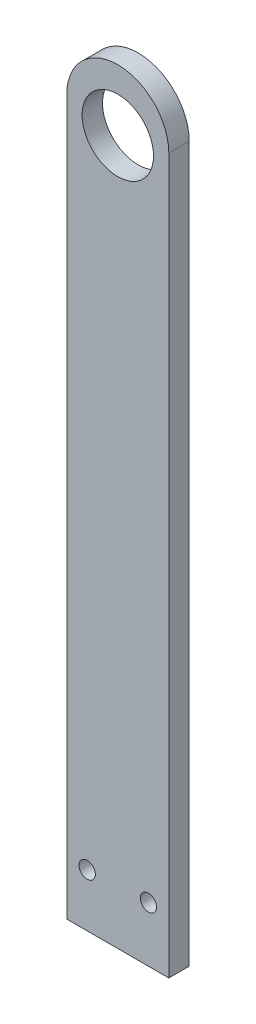
ISO-10303-21;
HEADER;
FILE_DESCRIPTION(('STEP AP214'),'2;1');
FILE_NAME('part.step','',(''),(''),'','','');
FILE_SCHEMA(('AUTOMOTIVE_DESIGN { 1 0 10303 214 1 1 1 1 }'));
ENDSEC;
DATA;
#1=APPLICATION_CONTEXT('core data for automotive mechanical design processes');
#2=APPLICATION_PROTOCOL_DEFINITION('international standard','automotive_design',2000,#1);
#3=PRODUCT_CONTEXT('',#1,'mechanical');
#4=PRODUCT('Part','Part','',(#3));
#5=PRODUCT_RELATED_PRODUCT_CATEGORY('part','',(#4));
#6=PRODUCT_DEFINITION_FORMATION('','',#4);
#7=PRODUCT_DEFINITION_CONTEXT('part definition',#1,'design');
#8=PRODUCT_DEFINITION('design','',#6,#7);
#9=PRODUCT_DEFINITION_SHAPE('','',#8);
#10=(LENGTH_UNIT() NAMED_UNIT(*) SI_UNIT(.MILLI.,.METRE.));
#11=(NAMED_UNIT(*) PLANE_ANGLE_UNIT() SI_UNIT($,.RADIAN.));
#12=(NAMED_UNIT(*) SI_UNIT($,.STERADIAN.) SOLID_ANGLE_UNIT());
#13=UNCERTAINTY_MEASURE_WITH_UNIT(LENGTH_MEASURE(1.E-05),#10,'distance_accuracy_value','');
#14=(GEOMETRIC_REPRESENTATION_CONTEXT(3) GLOBAL_UNCERTAINTY_ASSIGNED_CONTEXT((#13)) GLOBAL_UNIT_ASSIGNED_CONTEXT((#10,
#11,#12)) REPRESENTATION_CONTEXT('',''));
#15=CARTESIAN_POINT('',(0.,0.,0.));
#16=DIRECTION('',(0.,0.,1.));
#17=DIRECTION('',(1.,0.,0.));
#18=AXIS2_PLACEMENT_3D('',#15,#16,#17);
#19=CARTESIAN_POINT('',(0.,0.,4.));
#20=DIRECTION('',(0.,0.,1.));
#21=DIRECTION('',(1.,0.,0.));
#22=AXIS2_PLACEMENT_3D('',#19,#20,#21);
#23=PLANE('',#22);
#24=CARTESIAN_POINT('',(0.,63.,4.));
#25=DIRECTION('',(0.,0.,1.));
#26=DIRECTION('',(1.,0.,0.));
#27=AXIS2_PLACEMENT_3D('',#24,#25,#26);
#28=CIRCLE('',#27,7.);
#29=CARTESIAN_POINT('',(7.,63.,4.));
#30=VERTEX_POINT('',#29);
#31=EDGE_CURVE('E159',#30,#30,#28,.T.);
#32=ORIENTED_EDGE('',*,*,#31,.F.);
#33=EDGE_LOOP('',(#32));
#34=FACE_BOUND('',#33,.T.);
#35=CARTESIAN_POINT('',(-5.99999999999998,-64.6324163857344,4.));
#36=DIRECTION('',(0.,0.,1.));
#37=DIRECTION('',(1.,0.,0.));
#38=AXIS2_PLACEMENT_3D('',#35,#36,#37);
#39=CIRCLE('',#38,1.6);
#40=CARTESIAN_POINT('',(-4.39999999999998,-64.6324163857344,4.));
#41=VERTEX_POINT('',#40);
#42=EDGE_CURVE('E151',#41,#41,#39,.T.);
#43=ORIENTED_EDGE('',*,*,#42,.F.);
#44=EDGE_LOOP('',(#43));
#45=FACE_BOUND('',#44,.T.);
#46=CARTESIAN_POINT('',(6.00000000000002,-64.202233010576,4.));
#47=DIRECTION('',(0.,0.,1.));
#48=DIRECTION('',(1.,0.,0.));
#49=AXIS2_PLACEMENT_3D('',#46,#47,#48);
#50=CIRCLE('',#49,1.6);
#51=CARTESIAN_POINT('',(7.60000000000002,-64.202233010576,4.));
#52=VERTEX_POINT('',#51);
#53=EDGE_CURVE('E143',#52,#52,#50,.T.);
#54=ORIENTED_EDGE('',*,*,#53,.F.);
#55=EDGE_LOOP('',(#54));
#56=FACE_BOUND('',#55,.T.);
#57=DIRECTION('',(0.,1.,0.));
#58=VECTOR('',#57,1.);
#59=CARTESIAN_POINT('',(9.99999999999999,75.,4.));
#60=LINE('',#59,#58);
#61=CARTESIAN_POINT('',(10.,-75.,4.));
#62=VERTEX_POINT('',#61);
#63=CARTESIAN_POINT('',(9.99999999999999,65.,4.));
#64=VERTEX_POINT('',#63);
#65=EDGE_CURVE('E132',#62,#64,#60,.T.);
#66=ORIENTED_EDGE('',*,*,#65,.T.);
#67=CARTESIAN_POINT('',(0.,65.,4.));
#68=DIRECTION('',(0.,0.,1.));
#69=DIRECTION('',(1.,0.,0.));
#70=AXIS2_PLACEMENT_3D('',#67,#68,#69);
#71=CIRCLE('',#70,10.);
#72=CARTESIAN_POINT('',(-10.,65.,4.));
#73=VERTEX_POINT('',#72);
#74=EDGE_CURVE('E109',#64,#73,#71,.T.);
#75=ORIENTED_EDGE('',*,*,#74,.T.);
#76=DIRECTION('',(0.,-1.,0.));
#77=VECTOR('',#76,1.);
#78=CARTESIAN_POINT('',(-10.,75.,4.));
#79=LINE('',#78,#77);
#80=CARTESIAN_POINT('',(-9.99999999999999,-75.,4.));
#81=VERTEX_POINT('',#80);
#82=EDGE_CURVE('E135',#73,#81,#79,.T.);
#83=ORIENTED_EDGE('',*,*,#82,.T.);
#84=DIRECTION('',(1.,0.,0.));
#85=VECTOR('',#84,1.);
#86=CARTESIAN_POINT('',(-9.99999999999999,-75.,4.));
#87=LINE('',#86,#85);
#88=EDGE_CURVE('E75',#81,#62,#87,.T.);
#89=ORIENTED_EDGE('',*,*,#88,.T.);
#90=EDGE_LOOP('',(#66,#75,#83,#89));
#91=FACE_BOUND('',#90,.T.);
#92=ADVANCED_FACE('F57',(#34,#45,#56,#91),#23,.T.);
#93=CARTESIAN_POINT('',(0.,0.,0.));
#94=DIRECTION('',(0.,0.,1.));
#95=DIRECTION('',(1.,0.,0.));
#96=AXIS2_PLACEMENT_3D('',#93,#94,#95);
#97=PLANE('',#96);
#98=CARTESIAN_POINT('',(0.,63.,0.));
#99=DIRECTION('',(0.,0.,1.));
#100=DIRECTION('',(1.,0.,0.));
#101=AXIS2_PLACEMENT_3D('',#98,#99,#100);
#102=CIRCLE('',#101,7.);
#103=CARTESIAN_POINT('',(7.,63.,0.));
#104=VERTEX_POINT('',#103);
#105=EDGE_CURVE('E118',#104,#104,#102,.T.);
#106=ORIENTED_EDGE('',*,*,#105,.T.);
#107=EDGE_LOOP('',(#106));
#108=FACE_BOUND('',#107,.T.);
#109=CARTESIAN_POINT('',(-5.99999999999998,-64.6324163857344,0.));
#110=DIRECTION('',(0.,0.,1.));
#111=DIRECTION('',(1.,0.,0.));
#112=AXIS2_PLACEMENT_3D('',#109,#110,#111);
#113=CIRCLE('',#112,1.6);
#114=CARTESIAN_POINT('',(-4.39999999999998,-64.6324163857344,0.));
#115=VERTEX_POINT('',#114);
#116=EDGE_CURVE('E155',#115,#115,#113,.T.);
#117=ORIENTED_EDGE('',*,*,#116,.T.);
#118=EDGE_LOOP('',(#117));
#119=FACE_BOUND('',#118,.T.);
#120=CARTESIAN_POINT('',(6.00000000000002,-64.202233010576,0.));
#121=DIRECTION('',(0.,0.,1.));
#122=DIRECTION('',(1.,0.,0.));
#123=AXIS2_PLACEMENT_3D('',#120,#121,#122);
#124=CIRCLE('',#123,1.6);
#125=CARTESIAN_POINT('',(7.60000000000002,-64.202233010576,0.));
#126=VERTEX_POINT('',#125);
#127=EDGE_CURVE('E147',#126,#126,#124,.T.);
#128=ORIENTED_EDGE('',*,*,#127,.T.);
#129=EDGE_LOOP('',(#128));
#130=FACE_BOUND('',#129,.T.);
#131=CARTESIAN_POINT('',(0.,65.,0.));
#132=DIRECTION('',(0.,0.,1.));
#133=DIRECTION('',(1.,0.,0.));
#134=AXIS2_PLACEMENT_3D('',#131,#132,#133);
#135=CIRCLE('',#134,10.);
#136=CARTESIAN_POINT('',(9.99999999999999,65.,0.));
#137=VERTEX_POINT('',#136);
#138=CARTESIAN_POINT('',(-10.,65.,0.));
#139=VERTEX_POINT('',#138);
#140=EDGE_CURVE('E95',#137,#139,#135,.T.);
#141=ORIENTED_EDGE('',*,*,#140,.F.);
#142=DIRECTION('',(0.,1.,0.));
#143=VECTOR('',#142,1.);
#144=CARTESIAN_POINT('',(9.99999999999999,75.,0.));
#145=LINE('',#144,#143);
#146=CARTESIAN_POINT('',(10.,-75.,0.));
#147=VERTEX_POINT('',#146);
#148=EDGE_CURVE('E106',#147,#137,#145,.T.);
#149=ORIENTED_EDGE('',*,*,#148,.F.);
#150=DIRECTION('',(1.,0.,0.));
#151=VECTOR('',#150,1.);
#152=CARTESIAN_POINT('',(-9.99999999999999,-75.,0.));
#153=LINE('',#152,#151);
#154=CARTESIAN_POINT('',(-9.99999999999999,-75.,0.));
#155=VERTEX_POINT('',#154);
#156=EDGE_CURVE('E125',#155,#147,#153,.T.);
#157=ORIENTED_EDGE('',*,*,#156,.F.);
#158=DIRECTION('',(0.,-1.,0.));
#159=VECTOR('',#158,1.);
#160=CARTESIAN_POINT('',(-10.,75.,0.));
#161=LINE('',#160,#159);
#162=EDGE_CURVE('E86',#139,#155,#161,.T.);
#163=ORIENTED_EDGE('',*,*,#162,.F.);
#164=EDGE_LOOP('',(#141,#149,#157,#163));
#165=FACE_BOUND('',#164,.T.);
#166=ADVANCED_FACE('F103',(#108,#119,#130,#165),#97,.F.);
#167=CARTESIAN_POINT('',(-10.,75.,4.));
#168=DIRECTION('',(1.,0.,0.));
#169=DIRECTION('',(0.,1.,0.));
#170=AXIS2_PLACEMENT_3D('',#167,#168,#169);
#171=PLANE('',#170);
#172=DIRECTION('',(0.,0.,1.));
#173=VECTOR('',#172,1.);
#174=CARTESIAN_POINT('',(-10.,65.,0.));
#175=LINE('',#174,#173);
#176=EDGE_CURVE('E108',#139,#73,#175,.T.);
#177=ORIENTED_EDGE('',*,*,#176,.F.);
#178=ORIENTED_EDGE('',*,*,#162,.T.);
#179=DIRECTION('',(0.,0.,-1.));
#180=VECTOR('',#179,1.);
#181=CARTESIAN_POINT('',(-9.99999999999999,-75.,4.));
#182=LINE('',#181,#180);
#183=EDGE_CURVE('E12',#81,#155,#182,.T.);
#184=ORIENTED_EDGE('',*,*,#183,.F.);
#185=ORIENTED_EDGE('',*,*,#82,.F.);
#186=EDGE_LOOP('',(#177,#178,#184,#185));
#187=FACE_BOUND('',#186,.T.);
#188=ADVANCED_FACE('F182',(#187),#171,.F.);
#189=CARTESIAN_POINT('',(9.99999999999999,75.,4.));
#190=DIRECTION('',(-1.,0.,0.));
#191=DIRECTION('',(0.,-1.,0.));
#192=AXIS2_PLACEMENT_3D('',#189,#190,#191);
#193=PLANE('',#192);
#194=ORIENTED_EDGE('',*,*,#148,.T.);
#195=DIRECTION('',(0.,0.,1.));
#196=VECTOR('',#195,1.);
#197=CARTESIAN_POINT('',(9.99999999999999,65.,0.));
#198=LINE('',#197,#196);
#199=EDGE_CURVE('E112',#137,#64,#198,.T.);
#200=ORIENTED_EDGE('',*,*,#199,.T.);
#201=ORIENTED_EDGE('',*,*,#65,.F.);
#202=DIRECTION('',(0.,0.,-1.));
#203=VECTOR('',#202,1.);
#204=CARTESIAN_POINT('',(10.,-75.,4.));
#205=LINE('',#204,#203);
#206=EDGE_CURVE('E67',#62,#147,#205,.T.);
#207=ORIENTED_EDGE('',*,*,#206,.T.);
#208=EDGE_LOOP('',(#194,#200,#201,#207));
#209=FACE_BOUND('',#208,.T.);
#210=ADVANCED_FACE('F59',(#209),#193,.F.);
#211=CARTESIAN_POINT('',(-9.99999999999999,-75.,4.));
#212=DIRECTION('',(0.,1.,0.));
#213=DIRECTION('',(0.,0.,1.));
#214=AXIS2_PLACEMENT_3D('',#211,#212,#213);
#215=PLANE('',#214);
#216=ORIENTED_EDGE('',*,*,#156,.T.);
#217=ORIENTED_EDGE('',*,*,#206,.F.);
#218=ORIENTED_EDGE('',*,*,#88,.F.);
#219=ORIENTED_EDGE('',*,*,#183,.T.);
#220=EDGE_LOOP('',(#216,#217,#218,#219));
#221=FACE_BOUND('',#220,.T.);
#222=ADVANCED_FACE('F184',(#221),#215,.F.);
#223=CARTESIAN_POINT('',(0.,65.,0.));
#224=DIRECTION('',(0.,0.,1.));
#225=DIRECTION('',(1.,0.,0.));
#226=AXIS2_PLACEMENT_3D('',#223,#224,#225);
#227=CYLINDRICAL_SURFACE('',#226,10.);
#228=ORIENTED_EDGE('',*,*,#74,.F.);
#229=ORIENTED_EDGE('',*,*,#199,.F.);
#230=ORIENTED_EDGE('',*,*,#140,.T.);
#231=ORIENTED_EDGE('',*,*,#176,.T.);
#232=EDGE_LOOP('',(#228,#229,#230,#231));
#233=FACE_BOUND('',#232,.T.);
#234=ADVANCED_FACE('F113',(#233),#227,.T.);
#235=CARTESIAN_POINT('',(6.00000000000002,-64.202233010576,0.));
#236=DIRECTION('',(0.,0.,1.));
#237=DIRECTION('',(1.,0.,0.));
#238=AXIS2_PLACEMENT_3D('',#235,#236,#237);
#239=CYLINDRICAL_SURFACE('',#238,1.6);
#240=ORIENTED_EDGE('',*,*,#127,.F.);
#241=EDGE_LOOP('',(#240));
#242=FACE_BOUND('',#241,.T.);
#243=ORIENTED_EDGE('',*,*,#53,.T.);
#244=EDGE_LOOP('',(#243));
#245=FACE_BOUND('',#244,.T.);
#246=ADVANCED_FACE('F191',(#242,#245),#239,.F.);
#247=CARTESIAN_POINT('',(-5.99999999999998,-64.6324163857344,0.));
#248=DIRECTION('',(0.,0.,1.));
#249=DIRECTION('',(1.,0.,0.));
#250=AXIS2_PLACEMENT_3D('',#247,#248,#249);
#251=CYLINDRICAL_SURFACE('',#250,1.6);
#252=ORIENTED_EDGE('',*,*,#116,.F.);
#253=EDGE_LOOP('',(#252));
#254=FACE_BOUND('',#253,.T.);
#255=ORIENTED_EDGE('',*,*,#42,.T.);
#256=EDGE_LOOP('',(#255));
#257=FACE_BOUND('',#256,.T.);
#258=ADVANCED_FACE('F172',(#254,#257),#251,.F.);
#259=CARTESIAN_POINT('',(0.,63.,0.));
#260=DIRECTION('',(0.,0.,1.));
#261=DIRECTION('',(1.,0.,0.));
#262=AXIS2_PLACEMENT_3D('',#259,#260,#261);
#263=CYLINDRICAL_SURFACE('',#262,7.);
#264=ORIENTED_EDGE('',*,*,#105,.F.);
#265=EDGE_LOOP('',(#264));
#266=FACE_BOUND('',#265,.T.);
#267=ORIENTED_EDGE('',*,*,#31,.T.);
#268=EDGE_LOOP('',(#267));
#269=FACE_BOUND('',#268,.T.);
#270=ADVANCED_FACE('F169',(#266,#269),#263,.F.);
#271=CLOSED_SHELL('',(#92,#166,#188,#210,#222,#234,#246,#258,#270));
#272=MANIFOLD_SOLID_BREP('B2',#271);
#273=ADVANCED_BREP_SHAPE_REPRESENTATION('',(#18,#272),#14);
#274=SHAPE_DEFINITION_REPRESENTATION(#9,#273);
ENDSEC;
END-ISO-10303-21;
